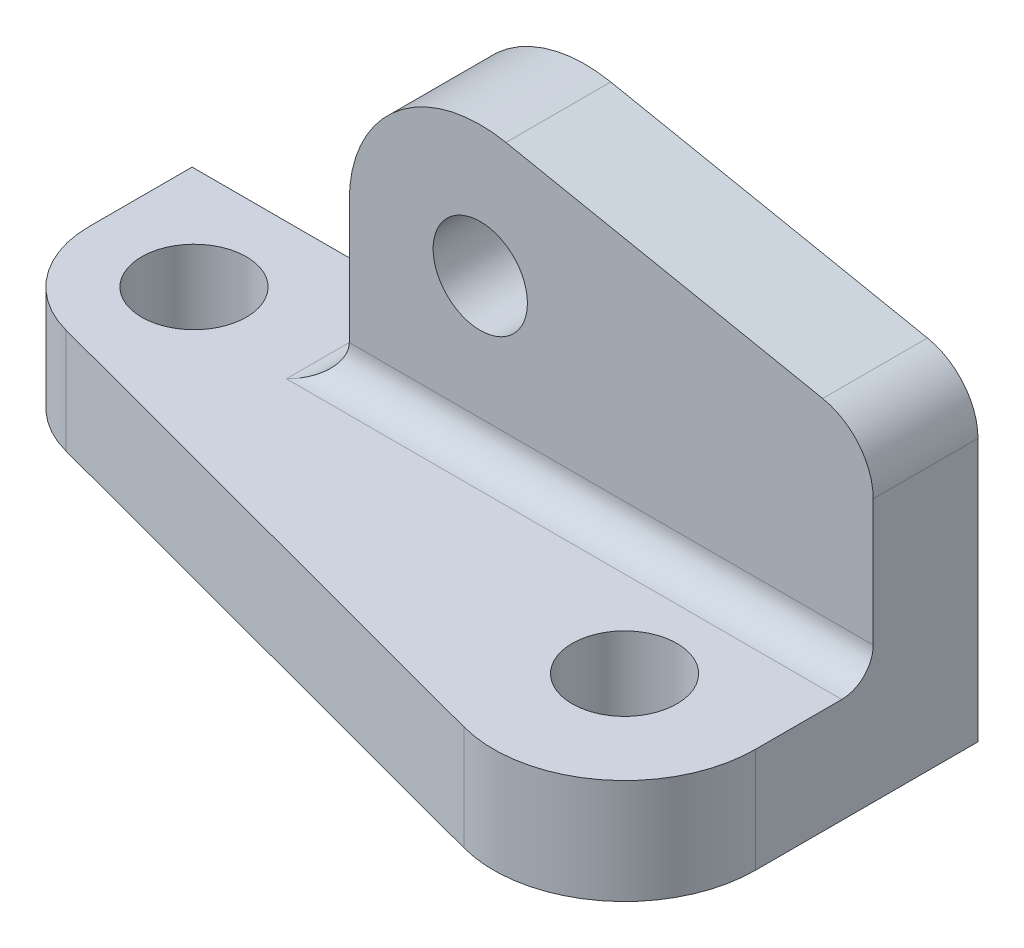
ISO-10303-21;
HEADER;
FILE_DESCRIPTION(('STEP AP214'),'2;1');
FILE_NAME('part.step','',(''),(''),'','','');
FILE_SCHEMA(('AUTOMOTIVE_DESIGN { 1 0 10303 214 1 1 1 1 }'));
ENDSEC;
DATA;
#1=APPLICATION_CONTEXT('core data for automotive mechanical design processes');
#2=APPLICATION_PROTOCOL_DEFINITION('international standard','automotive_design',2000,#1);
#3=PRODUCT_CONTEXT('',#1,'mechanical');
#4=PRODUCT('Part','Part','',(#3));
#5=PRODUCT_RELATED_PRODUCT_CATEGORY('part','',(#4));
#6=PRODUCT_DEFINITION_FORMATION('','',#4);
#7=PRODUCT_DEFINITION_CONTEXT('part definition',#1,'design');
#8=PRODUCT_DEFINITION('design','',#6,#7);
#9=PRODUCT_DEFINITION_SHAPE('','',#8);
#10=(LENGTH_UNIT() NAMED_UNIT(*) SI_UNIT(.MILLI.,.METRE.));
#11=(NAMED_UNIT(*) PLANE_ANGLE_UNIT() SI_UNIT($,.RADIAN.));
#12=(NAMED_UNIT(*) SI_UNIT($,.STERADIAN.) SOLID_ANGLE_UNIT());
#13=UNCERTAINTY_MEASURE_WITH_UNIT(LENGTH_MEASURE(1.E-05),#10,'distance_accuracy_value','');
#14=(GEOMETRIC_REPRESENTATION_CONTEXT(3) GLOBAL_UNCERTAINTY_ASSIGNED_CONTEXT((#13)) GLOBAL_UNIT_ASSIGNED_CONTEXT((#10,
#11,#12)) REPRESENTATION_CONTEXT('',''));
#15=CARTESIAN_POINT('',(0.,0.,0.));
#16=DIRECTION('',(0.,0.,1.));
#17=DIRECTION('',(1.,0.,0.));
#18=AXIS2_PLACEMENT_3D('',#15,#16,#17);
#19=CARTESIAN_POINT('',(0.,20.,0.));
#20=DIRECTION('',(1.,0.,0.));
#21=DIRECTION('',(0.,0.,-1.));
#22=AXIS2_PLACEMENT_3D('',#19,#20,#21);
#23=PLANE('',#22);
#24=DIRECTION('',(0.,0.,1.));
#25=VECTOR('',#24,1.);
#26=CARTESIAN_POINT('',(0.,0.,0.));
#27=LINE('',#26,#25);
#28=CARTESIAN_POINT('',(0.,0.,0.));
#29=VERTEX_POINT('',#28);
#30=CARTESIAN_POINT('',(0.,0.,19.63443373832));
#31=VERTEX_POINT('',#30);
#32=EDGE_CURVE('E172',#29,#31,#27,.T.);
#33=ORIENTED_EDGE('',*,*,#32,.T.);
#34=DIRECTION('',(0.,-1.,0.));
#35=VECTOR('',#34,1.);
#36=CARTESIAN_POINT('',(0.,20.,19.63443373832));
#37=LINE('',#36,#35);
#38=CARTESIAN_POINT('',(0.,20.,19.63443373832));
#39=VERTEX_POINT('',#38);
#40=EDGE_CURVE('E161',#31,#39,#37,.F.);
#41=ORIENTED_EDGE('',*,*,#40,.T.);
#42=DIRECTION('',(0.,0.,1.));
#43=VECTOR('',#42,1.);
#44=CARTESIAN_POINT('',(0.,20.,0.));
#45=LINE('',#44,#43);
#46=CARTESIAN_POINT('',(0.,20.,0.));
#47=VERTEX_POINT('',#46);
#48=EDGE_CURVE('E142',#47,#39,#45,.T.);
#49=ORIENTED_EDGE('',*,*,#48,.F.);
#50=DIRECTION('',(0.,-1.,0.));
#51=VECTOR('',#50,1.);
#52=CARTESIAN_POINT('',(0.,20.,0.));
#53=LINE('',#52,#51);
#54=EDGE_CURVE('E147',#47,#29,#53,.T.);
#55=ORIENTED_EDGE('',*,*,#54,.T.);
#56=EDGE_LOOP('',(#33,#41,#49,#55));
#57=FACE_BOUND('',#56,.T.);
#58=ADVANCED_FACE('F44',(#57),#23,.F.);
#59=CARTESIAN_POINT('',(0.,20.,35.));
#60=DIRECTION('',(0.257662650560332,0.,-0.966234939601246));
#61=DIRECTION('',(-0.966234939601246,0.,-0.257662650560332));
#62=AXIS2_PLACEMENT_3D('',#59,#60,#61);
#63=PLANE('',#62);
#64=DIRECTION('',(0.966234939601246,0.,0.257662650560332));
#65=VECTOR('',#64,1.);
#66=CARTESIAN_POINT('',(0.,20.,35.));
#67=LINE('',#66,#65);
#68=CARTESIAN_POINT('',(14.8467469887934,20.,38.9591325303449));
#69=VERTEX_POINT('',#68);
#70=CARTESIAN_POINT('',(118.558433735992,20.,66.6155823295978));
#71=VERTEX_POINT('',#70);
#72=EDGE_CURVE('E162',#69,#71,#67,.T.);
#73=ORIENTED_EDGE('',*,*,#72,.F.);
#74=DIRECTION('',(0.,-1.,0.));
#75=VECTOR('',#74,1.);
#76=CARTESIAN_POINT('',(14.8467469887934,20.,38.9591325303449));
#77=LINE('',#76,#75);
#78=CARTESIAN_POINT('',(14.8467469887934,0.,38.9591325303449));
#79=VERTEX_POINT('',#78);
#80=EDGE_CURVE('E201',#69,#79,#77,.T.);
#81=ORIENTED_EDGE('',*,*,#80,.T.);
#82=DIRECTION('',(0.966234939601246,0.,0.257662650560332));
#83=VECTOR('',#82,1.);
#84=CARTESIAN_POINT('',(0.,0.,35.));
#85=LINE('',#84,#83);
#86=CARTESIAN_POINT('',(118.558433735992,0.,66.6155823295978));
#87=VERTEX_POINT('',#86);
#88=EDGE_CURVE('E174',#79,#87,#85,.T.);
#89=ORIENTED_EDGE('',*,*,#88,.T.);
#90=DIRECTION('',(0.,-1.,0.));
#91=VECTOR('',#90,1.);
#92=CARTESIAN_POINT('',(118.558433735992,20.,66.6155823295978));
#93=LINE('',#92,#91);
#94=EDGE_CURVE('E196',#87,#71,#93,.F.);
#95=ORIENTED_EDGE('',*,*,#94,.T.);
#96=EDGE_LOOP('',(#73,#81,#89,#95));
#97=FACE_BOUND('',#96,.T.);
#98=ADVANCED_FACE('F256',(#97),#63,.F.);
#99=CARTESIAN_POINT('',(150.,20.,0.));
#100=DIRECTION('',(-1.,0.,0.));
#101=DIRECTION('',(0.,0.,1.));
#102=AXIS2_PLACEMENT_3D('',#99,#100,#101);
#103=PLANE('',#102);
#104=DIRECTION('',(0.,-1.,0.));
#105=VECTOR('',#104,1.);
#106=CARTESIAN_POINT('',(150.,20.,0.));
#107=LINE('',#106,#105);
#108=CARTESIAN_POINT('',(150.,50.1623531673773,0.));
#109=VERTEX_POINT('',#108);
#110=CARTESIAN_POINT('',(150.,0.,0.));
#111=VERTEX_POINT('',#110);
#112=EDGE_CURVE('E158',#109,#111,#107,.T.);
#113=ORIENTED_EDGE('',*,*,#112,.F.);
#114=DIRECTION('',(0.,0.,-1.));
#115=VECTOR('',#114,1.);
#116=CARTESIAN_POINT('',(150.,50.1623531673773,20.));
#117=LINE('',#116,#115);
#118=CARTESIAN_POINT('',(150.,50.1623531673773,20.));
#119=VERTEX_POINT('',#118);
#120=EDGE_CURVE('E214',#109,#119,#117,.F.);
#121=ORIENTED_EDGE('',*,*,#120,.T.);
#122=DIRECTION('',(0.,-1.,0.));
#123=VECTOR('',#122,1.);
#124=CARTESIAN_POINT('',(150.,0.,20.));
#125=LINE('',#124,#123);
#126=CARTESIAN_POINT('',(150.,26.,20.));
#127=VERTEX_POINT('',#126);
#128=EDGE_CURVE('E242',#119,#127,#125,.T.);
#129=ORIENTED_EDGE('',*,*,#128,.T.);
#130=CARTESIAN_POINT('',(150.,26.,26.));
#131=DIRECTION('',(-1.,0.,0.));
#132=DIRECTION('',(0.,0.,1.));
#133=AXIS2_PLACEMENT_3D('',#130,#131,#132);
#134=CIRCLE('',#133,6.);
#135=CARTESIAN_POINT('',(150.,20.,26.));
#136=VERTEX_POINT('',#135);
#137=EDGE_CURVE('E13',#127,#136,#134,.T.);
#138=ORIENTED_EDGE('',*,*,#137,.T.);
#139=DIRECTION('',(0.,0.,-1.));
#140=VECTOR('',#139,1.);
#141=CARTESIAN_POINT('',(150.,20.,0.));
#142=LINE('',#141,#140);
#143=CARTESIAN_POINT('',(150.,20.,42.4597088395666));
#144=VERTEX_POINT('',#143);
#145=EDGE_CURVE('E148',#144,#136,#142,.T.);
#146=ORIENTED_EDGE('',*,*,#145,.F.);
#147=DIRECTION('',(0.,-1.,0.));
#148=VECTOR('',#147,1.);
#149=CARTESIAN_POINT('',(150.,20.,42.4597088395666));
#150=LINE('',#149,#148);
#151=CARTESIAN_POINT('',(150.,0.,42.4597088395666));
#152=VERTEX_POINT('',#151);
#153=EDGE_CURVE('E190',#144,#152,#150,.T.);
#154=ORIENTED_EDGE('',*,*,#153,.T.);
#155=DIRECTION('',(0.,0.,-1.));
#156=VECTOR('',#155,1.);
#157=CARTESIAN_POINT('',(150.,0.,0.));
#158=LINE('',#157,#156);
#159=EDGE_CURVE('E165',#152,#111,#158,.T.);
#160=ORIENTED_EDGE('',*,*,#159,.T.);
#161=EDGE_LOOP('',(#113,#121,#129,#138,#146,#154,#160));
#162=FACE_BOUND('',#161,.T.);
#163=ADVANCED_FACE('F240',(#162),#103,.F.);
#164=CARTESIAN_POINT('',(0.,20.,0.));
#165=DIRECTION('',(0.,0.,1.));
#166=DIRECTION('',(1.,0.,0.));
#167=AXIS2_PLACEMENT_3D('',#164,#165,#166);
#168=PLANE('',#167);
#169=CARTESIAN_POINT('',(75.,49.5049024320361,0.));
#170=DIRECTION('',(0.,0.,1.));
#171=DIRECTION('',(1.,0.,0.));
#172=AXIS2_PLACEMENT_3D('',#169,#170,#171);
#173=CIRCLE('',#172,8.99999999999999);
#174=CARTESIAN_POINT('',(84.,49.5049024320361,0.));
#175=VERTEX_POINT('',#174);
#176=EDGE_CURVE('E415',#175,#175,#173,.T.);
#177=ORIENTED_EDGE('',*,*,#176,.T.);
#178=EDGE_LOOP('',(#177));
#179=FACE_BOUND('',#178,.T.);
#180=DIRECTION('',(0.98058067569092,-0.196116135138184,0.));
#181=VECTOR('',#180,1.);
#182=CARTESIAN_POINT('',(150.,60.,0.));
#183=LINE('',#182,#181);
#184=CARTESIAN_POINT('',(79.9029033784546,74.0194193243091,0.));
#185=VERTEX_POINT('',#184);
#186=CARTESIAN_POINT('',(140.353393621658,61.9293212756684,0.));
#187=VERTEX_POINT('',#186);
#188=EDGE_CURVE('E168',#185,#187,#183,.T.);
#189=ORIENTED_EDGE('',*,*,#188,.T.);
#190=CARTESIAN_POINT('',(138.,50.1623531673773,0.));
#191=DIRECTION('',(0.,0.,1.));
#192=DIRECTION('',(1.,0.,0.));
#193=AXIS2_PLACEMENT_3D('',#190,#191,#192);
#194=CIRCLE('',#193,12.);
#195=EDGE_CURVE('E212',#187,#109,#194,.F.);
#196=ORIENTED_EDGE('',*,*,#195,.T.);
#197=ORIENTED_EDGE('',*,*,#112,.T.);
#198=DIRECTION('',(-1.,0.,0.));
#199=VECTOR('',#198,1.);
#200=CARTESIAN_POINT('',(0.,0.,0.));
#201=LINE('',#200,#199);
#202=EDGE_CURVE('E154',#111,#29,#201,.T.);
#203=ORIENTED_EDGE('',*,*,#202,.T.);
#204=ORIENTED_EDGE('',*,*,#54,.F.);
#205=DIRECTION('',(-1.,0.,0.));
#206=VECTOR('',#205,1.);
#207=CARTESIAN_POINT('',(0.,20.,0.));
#208=LINE('',#207,#206);
#209=CARTESIAN_POINT('',(44.,20.,0.));
#210=VERTEX_POINT('',#209);
#211=EDGE_CURVE('E138',#210,#47,#208,.T.);
#212=ORIENTED_EDGE('',*,*,#211,.F.);
#213=CARTESIAN_POINT('',(44.,26.,0.));
#214=DIRECTION('',(0.,0.,1.));
#215=DIRECTION('',(1.,0.,0.));
#216=AXIS2_PLACEMENT_3D('',#213,#214,#215);
#217=CIRCLE('',#216,6.);
#218=CARTESIAN_POINT('',(50.,26.,0.));
#219=VERTEX_POINT('',#218);
#220=EDGE_CURVE('E53',#210,#219,#217,.T.);
#221=ORIENTED_EDGE('',*,*,#220,.T.);
#222=DIRECTION('',(0.,1.,0.));
#223=VECTOR('',#222,1.);
#224=CARTESIAN_POINT('',(50.,0.,0.));
#225=LINE('',#224,#223);
#226=CARTESIAN_POINT('',(50.,49.5049024320361,0.));
#227=VERTEX_POINT('',#226);
#228=EDGE_CURVE('E225',#219,#227,#225,.T.);
#229=ORIENTED_EDGE('',*,*,#228,.T.);
#230=CARTESIAN_POINT('',(75.,49.5049024320361,0.));
#231=DIRECTION('',(0.,0.,1.));
#232=DIRECTION('',(1.,0.,0.));
#233=AXIS2_PLACEMENT_3D('',#230,#231,#232);
#234=CIRCLE('',#233,25.);
#235=EDGE_CURVE('E183',#227,#185,#234,.F.);
#236=ORIENTED_EDGE('',*,*,#235,.T.);
#237=EDGE_LOOP('',(#189,#196,#197,#203,#204,#212,#221,#229,#236));
#238=FACE_BOUND('',#237,.T.);
#239=ADVANCED_FACE('F152',(#179,#238),#168,.F.);
#240=CARTESIAN_POINT('',(0.,20.,0.));
#241=DIRECTION('',(0.,1.,0.));
#242=DIRECTION('',(0.,0.,1.));
#243=AXIS2_PLACEMENT_3D('',#240,#241,#242);
#244=PLANE('',#243);
#245=CARTESIAN_POINT('',(125.,20.,42.4597088395666));
#246=DIRECTION('',(0.,1.,0.));
#247=DIRECTION('',(0.,0.,1.));
#248=AXIS2_PLACEMENT_3D('',#245,#246,#247);
#249=CIRCLE('',#248,9.99999999999998);
#250=CARTESIAN_POINT('',(125.,20.,52.4597088395666));
#251=VERTEX_POINT('',#250);
#252=EDGE_CURVE('E419',#251,#251,#249,.T.);
#253=ORIENTED_EDGE('',*,*,#252,.F.);
#254=EDGE_LOOP('',(#253));
#255=FACE_BOUND('',#254,.T.);
#256=CARTESIAN_POINT('',(20.,20.,19.63443373832));
#257=DIRECTION('',(0.,1.,0.));
#258=DIRECTION('',(0.,0.,1.));
#259=AXIS2_PLACEMENT_3D('',#256,#257,#258);
#260=CIRCLE('',#259,9.99999999999999);
#261=CARTESIAN_POINT('',(20.,20.,29.63443373832));
#262=VERTEX_POINT('',#261);
#263=EDGE_CURVE('E428',#262,#262,#260,.T.);
#264=ORIENTED_EDGE('',*,*,#263,.F.);
#265=EDGE_LOOP('',(#264));
#266=FACE_BOUND('',#265,.T.);
#267=DIRECTION('',(1.,0.,0.));
#268=VECTOR('',#267,1.);
#269=CARTESIAN_POINT('',(50.,20.,26.));
#270=LINE('',#269,#268);
#271=CARTESIAN_POINT('',(44.,20.,26.));
#272=VERTEX_POINT('',#271);
#273=EDGE_CURVE('E68',#136,#272,#270,.F.);
#274=ORIENTED_EDGE('',*,*,#273,.T.);
#275=DIRECTION('',(0.,0.,1.));
#276=VECTOR('',#275,1.);
#277=CARTESIAN_POINT('',(44.,20.,0.));
#278=LINE('',#277,#276);
#279=EDGE_CURVE('E144',#272,#210,#278,.F.);
#280=ORIENTED_EDGE('',*,*,#279,.T.);
#281=ORIENTED_EDGE('',*,*,#211,.T.);
#282=ORIENTED_EDGE('',*,*,#48,.T.);
#283=CARTESIAN_POINT('',(20.,20.,19.63443373832));
#284=DIRECTION('',(0.,1.,0.));
#285=DIRECTION('',(0.,0.,1.));
#286=AXIS2_PLACEMENT_3D('',#283,#284,#285);
#287=CIRCLE('',#286,20.);
#288=EDGE_CURVE('E207',#39,#69,#287,.T.);
#289=ORIENTED_EDGE('',*,*,#288,.T.);
#290=ORIENTED_EDGE('',*,*,#72,.T.);
#291=CARTESIAN_POINT('',(125.,20.,42.4597088395666));
#292=DIRECTION('',(0.,1.,0.));
#293=DIRECTION('',(0.,0.,1.));
#294=AXIS2_PLACEMENT_3D('',#291,#292,#293);
#295=CIRCLE('',#294,25.);
#296=EDGE_CURVE('E199',#71,#144,#295,.T.);
#297=ORIENTED_EDGE('',*,*,#296,.T.);
#298=ORIENTED_EDGE('',*,*,#145,.T.);
#299=EDGE_LOOP('',(#274,#280,#281,#282,#289,#290,#297,#298));
#300=FACE_BOUND('',#299,.T.);
#301=ADVANCED_FACE('F140',(#255,#266,#300),#244,.T.);
#302=CARTESIAN_POINT('',(0.,0.,0.));
#303=DIRECTION('',(0.,1.,0.));
#304=DIRECTION('',(0.,0.,1.));
#305=AXIS2_PLACEMENT_3D('',#302,#303,#304);
#306=PLANE('',#305);
#307=CARTESIAN_POINT('',(125.,0.,42.4597088395666));
#308=DIRECTION('',(0.,1.,0.));
#309=DIRECTION('',(0.,0.,1.));
#310=AXIS2_PLACEMENT_3D('',#307,#308,#309);
#311=CIRCLE('',#310,10.);
#312=CARTESIAN_POINT('',(125.,0.,52.4597088395666));
#313=VERTEX_POINT('',#312);
#314=EDGE_CURVE('E422',#313,#313,#311,.T.);
#315=ORIENTED_EDGE('',*,*,#314,.T.);
#316=EDGE_LOOP('',(#315));
#317=FACE_BOUND('',#316,.T.);
#318=CARTESIAN_POINT('',(20.,0.,19.63443373832));
#319=DIRECTION('',(0.,1.,0.));
#320=DIRECTION('',(0.,0.,1.));
#321=AXIS2_PLACEMENT_3D('',#318,#319,#320);
#322=CIRCLE('',#321,9.99999999999999);
#323=CARTESIAN_POINT('',(20.,0.,29.63443373832));
#324=VERTEX_POINT('',#323);
#325=EDGE_CURVE('E235',#324,#324,#322,.T.);
#326=ORIENTED_EDGE('',*,*,#325,.T.);
#327=EDGE_LOOP('',(#326));
#328=FACE_BOUND('',#327,.T.);
#329=ORIENTED_EDGE('',*,*,#88,.F.);
#330=CARTESIAN_POINT('',(20.,0.,19.63443373832));
#331=DIRECTION('',(0.,1.,0.));
#332=DIRECTION('',(0.,0.,1.));
#333=AXIS2_PLACEMENT_3D('',#330,#331,#332);
#334=CIRCLE('',#333,20.);
#335=EDGE_CURVE('E204',#79,#31,#334,.F.);
#336=ORIENTED_EDGE('',*,*,#335,.T.);
#337=ORIENTED_EDGE('',*,*,#32,.F.);
#338=ORIENTED_EDGE('',*,*,#202,.F.);
#339=ORIENTED_EDGE('',*,*,#159,.F.);
#340=CARTESIAN_POINT('',(125.,0.,42.4597088395666));
#341=DIRECTION('',(0.,1.,0.));
#342=DIRECTION('',(0.,0.,1.));
#343=AXIS2_PLACEMENT_3D('',#340,#341,#342);
#344=CIRCLE('',#343,25.);
#345=EDGE_CURVE('E193',#152,#87,#344,.F.);
#346=ORIENTED_EDGE('',*,*,#345,.T.);
#347=EDGE_LOOP('',(#329,#336,#337,#338,#339,#346));
#348=FACE_BOUND('',#347,.T.);
#349=ADVANCED_FACE('F251',(#317,#328,#348),#306,.F.);
#350=CARTESIAN_POINT('',(150.,60.,20.));
#351=DIRECTION('',(0.196116135138184,0.98058067569092,0.));
#352=DIRECTION('',(-0.98058067569092,0.196116135138184,0.));
#353=AXIS2_PLACEMENT_3D('',#350,#351,#352);
#354=PLANE('',#353);
#355=DIRECTION('',(0.98058067569092,-0.196116135138184,0.));
#356=VECTOR('',#355,1.);
#357=CARTESIAN_POINT('',(150.,60.,20.));
#358=LINE('',#357,#356);
#359=CARTESIAN_POINT('',(79.9029033784546,74.0194193243091,20.));
#360=VERTEX_POINT('',#359);
#361=CARTESIAN_POINT('',(140.353393621658,61.9293212756684,20.));
#362=VERTEX_POINT('',#361);
#363=EDGE_CURVE('E175',#360,#362,#358,.T.);
#364=ORIENTED_EDGE('',*,*,#363,.T.);
#365=DIRECTION('',(0.,0.,-1.));
#366=VECTOR('',#365,1.);
#367=CARTESIAN_POINT('',(140.353393621658,61.9293212756684,0.));
#368=LINE('',#367,#366);
#369=EDGE_CURVE('E209',#362,#187,#368,.T.);
#370=ORIENTED_EDGE('',*,*,#369,.T.);
#371=ORIENTED_EDGE('',*,*,#188,.F.);
#372=DIRECTION('',(0.,0.,-1.));
#373=VECTOR('',#372,1.);
#374=CARTESIAN_POINT('',(79.9029033784546,74.0194193243091,20.));
#375=LINE('',#374,#373);
#376=EDGE_CURVE('E185',#185,#360,#375,.F.);
#377=ORIENTED_EDGE('',*,*,#376,.T.);
#378=EDGE_LOOP('',(#364,#370,#371,#377));
#379=FACE_BOUND('',#378,.T.);
#380=ADVANCED_FACE('F324',(#379),#354,.T.);
#381=CARTESIAN_POINT('',(50.,0.,20.));
#382=DIRECTION('',(-1.,0.,0.));
#383=DIRECTION('',(0.,0.,1.));
#384=AXIS2_PLACEMENT_3D('',#381,#382,#383);
#385=PLANE('',#384);
#386=ORIENTED_EDGE('',*,*,#228,.F.);
#387=DIRECTION('',(0.,0.,1.));
#388=VECTOR('',#387,1.);
#389=CARTESIAN_POINT('',(50.,26.,20.));
#390=LINE('',#389,#388);
#391=CARTESIAN_POINT('',(50.,26.,20.));
#392=VERTEX_POINT('',#391);
#393=EDGE_CURVE('E218',#219,#392,#390,.T.);
#394=ORIENTED_EDGE('',*,*,#393,.T.);
#395=DIRECTION('',(0.,1.,0.));
#396=VECTOR('',#395,1.);
#397=CARTESIAN_POINT('',(50.,0.,20.));
#398=LINE('',#397,#396);
#399=CARTESIAN_POINT('',(50.,49.5049024320361,20.));
#400=VERTEX_POINT('',#399);
#401=EDGE_CURVE('E434',#392,#400,#398,.T.);
#402=ORIENTED_EDGE('',*,*,#401,.T.);
#403=DIRECTION('',(0.,0.,-1.));
#404=VECTOR('',#403,1.);
#405=CARTESIAN_POINT('',(50.,49.5049024320361,20.));
#406=LINE('',#405,#404);
#407=EDGE_CURVE('E180',#400,#227,#406,.T.);
#408=ORIENTED_EDGE('',*,*,#407,.T.);
#409=EDGE_LOOP('',(#386,#394,#402,#408));
#410=FACE_BOUND('',#409,.T.);
#411=ADVANCED_FACE('F230',(#410),#385,.T.);
#412=CARTESIAN_POINT('',(150.,0.,20.));
#413=DIRECTION('',(0.,0.,1.));
#414=DIRECTION('',(1.,0.,0.));
#415=AXIS2_PLACEMENT_3D('',#412,#413,#414);
#416=PLANE('',#415);
#417=CARTESIAN_POINT('',(75.,49.5049024320361,19.999999999925));
#418=DIRECTION('',(0.,0.,1.));
#419=DIRECTION('',(1.,0.,0.));
#420=AXIS2_PLACEMENT_3D('',#417,#418,#419);
#421=CIRCLE('',#420,8.99999999999999);
#422=CARTESIAN_POINT('',(84.,49.5049024320361,19.999999999925));
#423=VERTEX_POINT('',#422);
#424=EDGE_CURVE('E418',#423,#423,#421,.T.);
#425=ORIENTED_EDGE('',*,*,#424,.F.);
#426=EDGE_LOOP('',(#425));
#427=FACE_BOUND('',#426,.T.);
#428=ORIENTED_EDGE('',*,*,#401,.F.);
#429=DIRECTION('',(1.,0.,0.));
#430=VECTOR('',#429,1.);
#431=CARTESIAN_POINT('',(150.,26.,20.));
#432=LINE('',#431,#430);
#433=EDGE_CURVE('E60',#392,#127,#432,.T.);
#434=ORIENTED_EDGE('',*,*,#433,.T.);
#435=ORIENTED_EDGE('',*,*,#128,.F.);
#436=CARTESIAN_POINT('',(138.,50.1623531673773,20.));
#437=DIRECTION('',(0.,0.,1.));
#438=DIRECTION('',(1.,0.,0.));
#439=AXIS2_PLACEMENT_3D('',#436,#437,#438);
#440=CIRCLE('',#439,12.);
#441=EDGE_CURVE('E216',#119,#362,#440,.T.);
#442=ORIENTED_EDGE('',*,*,#441,.T.);
#443=ORIENTED_EDGE('',*,*,#363,.F.);
#444=CARTESIAN_POINT('',(75.,49.5049024320361,20.));
#445=DIRECTION('',(0.,0.,1.));
#446=DIRECTION('',(1.,0.,0.));
#447=AXIS2_PLACEMENT_3D('',#444,#445,#446);
#448=CIRCLE('',#447,25.);
#449=EDGE_CURVE('E187',#360,#400,#448,.T.);
#450=ORIENTED_EDGE('',*,*,#449,.T.);
#451=EDGE_LOOP('',(#428,#434,#435,#442,#443,#450));
#452=FACE_BOUND('',#451,.T.);
#453=ADVANCED_FACE('F270',(#427,#452),#416,.T.);
#454=CARTESIAN_POINT('',(75.,49.5049024320361,20.));
#455=DIRECTION('',(0.,0.,-1.));
#456=DIRECTION('',(-1.,0.,0.));
#457=AXIS2_PLACEMENT_3D('',#454,#455,#456);
#458=CYLINDRICAL_SURFACE('',#457,25.);
#459=ORIENTED_EDGE('',*,*,#449,.F.);
#460=ORIENTED_EDGE('',*,*,#376,.F.);
#461=ORIENTED_EDGE('',*,*,#235,.F.);
#462=ORIENTED_EDGE('',*,*,#407,.F.);
#463=EDGE_LOOP('',(#459,#460,#461,#462));
#464=FACE_BOUND('',#463,.T.);
#465=ADVANCED_FACE('F267',(#464),#458,.T.);
#466=CARTESIAN_POINT('',(125.,20.,42.4597088395666));
#467=DIRECTION('',(0.,-1.,0.));
#468=DIRECTION('',(0.,0.,-1.));
#469=AXIS2_PLACEMENT_3D('',#466,#467,#468);
#470=CYLINDRICAL_SURFACE('',#469,25.);
#471=ORIENTED_EDGE('',*,*,#296,.F.);
#472=ORIENTED_EDGE('',*,*,#94,.F.);
#473=ORIENTED_EDGE('',*,*,#345,.F.);
#474=ORIENTED_EDGE('',*,*,#153,.F.);
#475=EDGE_LOOP('',(#471,#472,#473,#474));
#476=FACE_BOUND('',#475,.T.);
#477=ADVANCED_FACE('F247',(#476),#470,.T.);
#478=CARTESIAN_POINT('',(20.,20.,19.63443373832));
#479=DIRECTION('',(0.,-1.,0.));
#480=DIRECTION('',(0.,0.,-1.));
#481=AXIS2_PLACEMENT_3D('',#478,#479,#480);
#482=CYLINDRICAL_SURFACE('',#481,20.);
#483=ORIENTED_EDGE('',*,*,#288,.F.);
#484=ORIENTED_EDGE('',*,*,#40,.F.);
#485=ORIENTED_EDGE('',*,*,#335,.F.);
#486=ORIENTED_EDGE('',*,*,#80,.F.);
#487=EDGE_LOOP('',(#483,#484,#485,#486));
#488=FACE_BOUND('',#487,.T.);
#489=ADVANCED_FACE('F253',(#488),#482,.T.);
#490=CARTESIAN_POINT('',(138.,50.1623531673773,20.));
#491=DIRECTION('',(0.,0.,1.));
#492=DIRECTION('',(1.,0.,0.));
#493=AXIS2_PLACEMENT_3D('',#490,#491,#492);
#494=CYLINDRICAL_SURFACE('',#493,12.);
#495=ORIENTED_EDGE('',*,*,#441,.F.);
#496=ORIENTED_EDGE('',*,*,#120,.F.);
#497=ORIENTED_EDGE('',*,*,#195,.F.);
#498=ORIENTED_EDGE('',*,*,#369,.F.);
#499=EDGE_LOOP('',(#495,#496,#497,#498));
#500=FACE_BOUND('',#499,.T.);
#501=ADVANCED_FACE('F276',(#500),#494,.T.);
#502=CARTESIAN_POINT('',(150.,26.,26.));
#503=DIRECTION('',(-1.,0.,0.));
#504=DIRECTION('',(0.,0.,1.));
#505=AXIS2_PLACEMENT_3D('',#502,#503,#504);
#506=CYLINDRICAL_SURFACE('',#505,6.);
#507=ORIENTED_EDGE('',*,*,#137,.F.);
#508=ORIENTED_EDGE('',*,*,#433,.F.);
#509=CARTESIAN_POINT('',(44.,26.,26.));
#510=DIRECTION('',(-0.707106781186547,0.,-0.707106781186547));
#511=DIRECTION('',(-0.707106781186547,0.,0.707106781186547));
#512=AXIS2_PLACEMENT_3D('',#509,#510,#511);
#513=ELLIPSE('',#512,8.48528137423857,6.);
#514=EDGE_CURVE('E48',#272,#392,#513,.F.);
#515=ORIENTED_EDGE('',*,*,#514,.F.);
#516=ORIENTED_EDGE('',*,*,#273,.F.);
#517=EDGE_LOOP('',(#507,#508,#515,#516));
#518=FACE_BOUND('',#517,.T.);
#519=ADVANCED_FACE('F46',(#518),#506,.F.);
#520=CARTESIAN_POINT('',(44.,26.,20.));
#521=DIRECTION('',(0.,0.,-1.));
#522=DIRECTION('',(-1.,0.,0.));
#523=AXIS2_PLACEMENT_3D('',#520,#521,#522);
#524=CYLINDRICAL_SURFACE('',#523,6.);
#525=ORIENTED_EDGE('',*,*,#220,.F.);
#526=ORIENTED_EDGE('',*,*,#279,.F.);
#527=ORIENTED_EDGE('',*,*,#514,.T.);
#528=ORIENTED_EDGE('',*,*,#393,.F.);
#529=EDGE_LOOP('',(#525,#526,#527,#528));
#530=FACE_BOUND('',#529,.T.);
#531=ADVANCED_FACE('F232',(#530),#524,.F.);
#532=CARTESIAN_POINT('',(20.,20.,19.63443373832));
#533=DIRECTION('',(0.,1.,0.));
#534=DIRECTION('',(0.,0.,1.));
#535=AXIS2_PLACEMENT_3D('',#532,#533,#534);
#536=CYLINDRICAL_SURFACE('',#535,9.99999999999999);
#537=ORIENTED_EDGE('',*,*,#325,.F.);
#538=EDGE_LOOP('',(#537));
#539=FACE_BOUND('',#538,.T.);
#540=ORIENTED_EDGE('',*,*,#263,.T.);
#541=EDGE_LOOP('',(#540));
#542=FACE_BOUND('',#541,.T.);
#543=ADVANCED_FACE('F280',(#539,#542),#536,.F.);
#544=CARTESIAN_POINT('',(125.,20.,42.4597088395666));
#545=DIRECTION('',(0.,1.,0.));
#546=DIRECTION('',(0.,0.,1.));
#547=AXIS2_PLACEMENT_3D('',#544,#545,#546);
#548=CYLINDRICAL_SURFACE('',#547,9.99999999999999);
#549=ORIENTED_EDGE('',*,*,#314,.F.);
#550=EDGE_LOOP('',(#549));
#551=FACE_BOUND('',#550,.T.);
#552=ORIENTED_EDGE('',*,*,#252,.T.);
#553=EDGE_LOOP('',(#552));
#554=FACE_BOUND('',#553,.T.);
#555=ADVANCED_FACE('F285',(#551,#554),#548,.F.);
#556=CARTESIAN_POINT('',(75.,49.5049024320361,19.999999999925));
#557=DIRECTION('',(0.,0.,1.));
#558=DIRECTION('',(1.,0.,0.));
#559=AXIS2_PLACEMENT_3D('',#556,#557,#558);
#560=CYLINDRICAL_SURFACE('',#559,8.99999999999999);
#561=ORIENTED_EDGE('',*,*,#176,.F.);
#562=EDGE_LOOP('',(#561));
#563=FACE_BOUND('',#562,.T.);
#564=ORIENTED_EDGE('',*,*,#424,.T.);
#565=EDGE_LOOP('',(#564));
#566=FACE_BOUND('',#565,.T.);
#567=ADVANCED_FACE('F399',(#563,#566),#560,.F.);
#568=CLOSED_SHELL('',(#58,#98,#163,#239,#301,#349,#380,#411,#453,#465,#477,#489,#501,#519,#531,
#543,#555,#567));
#569=MANIFOLD_SOLID_BREP('B2',#568);
#570=ADVANCED_BREP_SHAPE_REPRESENTATION('',(#18,#569),#14);
#571=SHAPE_DEFINITION_REPRESENTATION(#9,#570);
ENDSEC;
END-ISO-10303-21;
